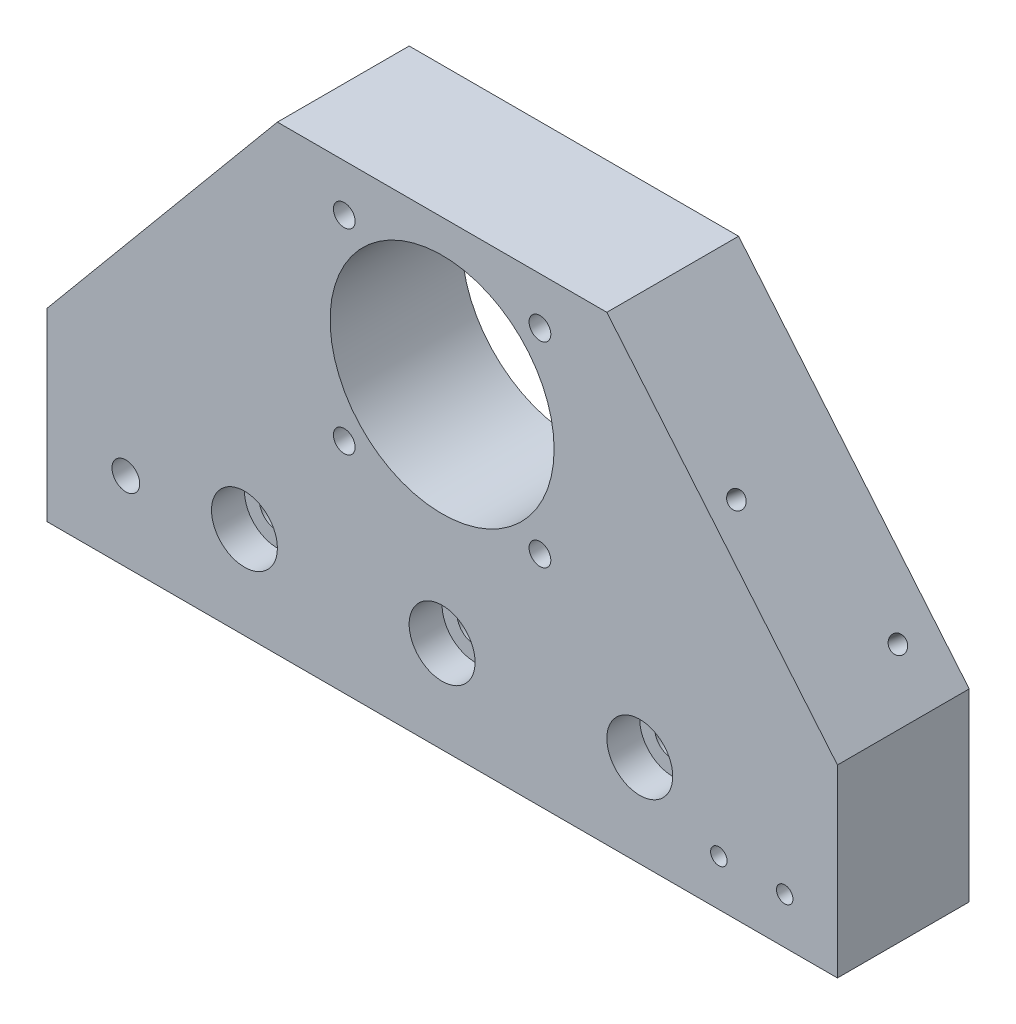
ISO-10303-21;
HEADER;
FILE_DESCRIPTION(('STEP AP214'),'2;1');
FILE_NAME('part.step','',(''),(''),'','','');
FILE_SCHEMA(('AUTOMOTIVE_DESIGN { 1 0 10303 214 1 1 1 1 }'));
ENDSEC;
DATA;
#1=APPLICATION_CONTEXT('core data for automotive mechanical design processes');
#2=APPLICATION_PROTOCOL_DEFINITION('international standard','automotive_design',2000,#1);
#3=PRODUCT_CONTEXT('',#1,'mechanical');
#4=PRODUCT('Part','Part','',(#3));
#5=PRODUCT_RELATED_PRODUCT_CATEGORY('part','',(#4));
#6=PRODUCT_DEFINITION_FORMATION('','',#4);
#7=PRODUCT_DEFINITION_CONTEXT('part definition',#1,'design');
#8=PRODUCT_DEFINITION('design','',#6,#7);
#9=PRODUCT_DEFINITION_SHAPE('','',#8);
#10=(LENGTH_UNIT() NAMED_UNIT(*) SI_UNIT(.MILLI.,.METRE.));
#11=(NAMED_UNIT(*) PLANE_ANGLE_UNIT() SI_UNIT($,.RADIAN.));
#12=(NAMED_UNIT(*) SI_UNIT($,.STERADIAN.) SOLID_ANGLE_UNIT());
#13=UNCERTAINTY_MEASURE_WITH_UNIT(LENGTH_MEASURE(1.E-05),#10,'distance_accuracy_value','');
#14=(GEOMETRIC_REPRESENTATION_CONTEXT(3) GLOBAL_UNCERTAINTY_ASSIGNED_CONTEXT((#13)) GLOBAL_UNIT_ASSIGNED_CONTEXT((#10,
#11,#12)) REPRESENTATION_CONTEXT('',''));
#15=CARTESIAN_POINT('',(0.,0.,0.));
#16=DIRECTION('',(0.,0.,1.));
#17=DIRECTION('',(1.,0.,0.));
#18=AXIS2_PLACEMENT_3D('',#15,#16,#17);
#19=CARTESIAN_POINT('',(-60.,0.,20.));
#20=DIRECTION('',(1.,0.,0.));
#21=DIRECTION('',(0.,0.,-1.));
#22=AXIS2_PLACEMENT_3D('',#19,#20,#21);
#23=PLANE('',#22);
#24=DIRECTION('',(0.,-1.,0.));
#25=VECTOR('',#24,1.);
#26=CARTESIAN_POINT('',(-60.,0.,0.));
#27=LINE('',#26,#25);
#28=CARTESIAN_POINT('',(-60.,28.,0.));
#29=VERTEX_POINT('',#28);
#30=CARTESIAN_POINT('',(-60.,0.,0.));
#31=VERTEX_POINT('',#30);
#32=EDGE_CURVE('E122',#29,#31,#27,.T.);
#33=ORIENTED_EDGE('',*,*,#32,.T.);
#34=DIRECTION('',(0.,0.,-1.));
#35=VECTOR('',#34,1.);
#36=CARTESIAN_POINT('',(-60.,0.,20.));
#37=LINE('',#36,#35);
#38=CARTESIAN_POINT('',(-60.,0.,20.));
#39=VERTEX_POINT('',#38);
#40=EDGE_CURVE('E11',#39,#31,#37,.T.);
#41=ORIENTED_EDGE('',*,*,#40,.F.);
#42=DIRECTION('',(0.,-1.,0.));
#43=VECTOR('',#42,1.);
#44=CARTESIAN_POINT('',(-60.,0.,20.));
#45=LINE('',#44,#43);
#46=CARTESIAN_POINT('',(-60.,28.,20.));
#47=VERTEX_POINT('',#46);
#48=EDGE_CURVE('E133',#47,#39,#45,.T.);
#49=ORIENTED_EDGE('',*,*,#48,.F.);
#50=DIRECTION('',(0.,0.,-1.));
#51=VECTOR('',#50,1.);
#52=CARTESIAN_POINT('',(-60.,28.,20.));
#53=LINE('',#52,#51);
#54=EDGE_CURVE('E118',#47,#29,#53,.T.);
#55=ORIENTED_EDGE('',*,*,#54,.T.);
#56=EDGE_LOOP('',(#33,#41,#49,#55));
#57=FACE_BOUND('',#56,.T.);
#58=ADVANCED_FACE('F35',(#57),#23,.F.);
#59=CARTESIAN_POINT('',(60.,0.,20.));
#60=DIRECTION('',(0.,1.,0.));
#61=DIRECTION('',(0.,0.,1.));
#62=AXIS2_PLACEMENT_3D('',#59,#60,#61);
#63=PLANE('',#62);
#64=CARTESIAN_POINT('',(-20.,0.,10.));
#65=DIRECTION('',(0.,-1.,0.));
#66=DIRECTION('',(0.,0.,-1.));
#67=AXIS2_PLACEMENT_3D('',#64,#65,#66);
#68=CIRCLE('',#67,1.64999999999999);
#69=CARTESIAN_POINT('',(-20.,0.,8.35000000000001));
#70=VERTEX_POINT('',#69);
#71=EDGE_CURVE('E206',#70,#70,#68,.T.);
#72=ORIENTED_EDGE('',*,*,#71,.F.);
#73=EDGE_LOOP('',(#72));
#74=FACE_BOUND('',#73,.T.);
#75=CARTESIAN_POINT('',(20.,0.,10.));
#76=DIRECTION('',(0.,-1.,0.));
#77=DIRECTION('',(0.,0.,-1.));
#78=AXIS2_PLACEMENT_3D('',#75,#76,#77);
#79=CIRCLE('',#78,1.64999999999999);
#80=CARTESIAN_POINT('',(20.,0.,8.35000000000001));
#81=VERTEX_POINT('',#80);
#82=EDGE_CURVE('E212',#81,#81,#79,.T.);
#83=ORIENTED_EDGE('',*,*,#82,.F.);
#84=EDGE_LOOP('',(#83));
#85=FACE_BOUND('',#84,.T.);
#86=DIRECTION('',(1.,0.,0.));
#87=VECTOR('',#86,1.);
#88=CARTESIAN_POINT('',(60.,0.,0.));
#89=LINE('',#88,#87);
#90=CARTESIAN_POINT('',(60.,0.,0.));
#91=VERTEX_POINT('',#90);
#92=EDGE_CURVE('E125',#31,#91,#89,.T.);
#93=ORIENTED_EDGE('',*,*,#92,.T.);
#94=DIRECTION('',(0.,0.,-1.));
#95=VECTOR('',#94,1.);
#96=CARTESIAN_POINT('',(60.,0.,20.));
#97=LINE('',#96,#95);
#98=CARTESIAN_POINT('',(60.,0.,20.));
#99=VERTEX_POINT('',#98);
#100=EDGE_CURVE('E43',#99,#91,#97,.T.);
#101=ORIENTED_EDGE('',*,*,#100,.F.);
#102=DIRECTION('',(1.,0.,0.));
#103=VECTOR('',#102,1.);
#104=CARTESIAN_POINT('',(60.,0.,20.));
#105=LINE('',#104,#103);
#106=EDGE_CURVE('E89',#39,#99,#105,.T.);
#107=ORIENTED_EDGE('',*,*,#106,.F.);
#108=ORIENTED_EDGE('',*,*,#40,.T.);
#109=EDGE_LOOP('',(#93,#101,#107,#108));
#110=FACE_BOUND('',#109,.T.);
#111=ADVANCED_FACE('F159',(#74,#85,#110),#63,.F.);
#112=CARTESIAN_POINT('',(60.,0.,20.));
#113=DIRECTION('',(-1.,0.,0.));
#114=DIRECTION('',(0.,0.,1.));
#115=AXIS2_PLACEMENT_3D('',#112,#113,#114);
#116=PLANE('',#115);
#117=DIRECTION('',(0.,1.,0.));
#118=VECTOR('',#117,1.);
#119=CARTESIAN_POINT('',(60.,0.,0.));
#120=LINE('',#119,#118);
#121=CARTESIAN_POINT('',(60.,28.,0.));
#122=VERTEX_POINT('',#121);
#123=EDGE_CURVE('E128',#91,#122,#120,.T.);
#124=ORIENTED_EDGE('',*,*,#123,.T.);
#125=DIRECTION('',(0.,0.,-1.));
#126=VECTOR('',#125,1.);
#127=CARTESIAN_POINT('',(60.,28.,20.));
#128=LINE('',#127,#126);
#129=CARTESIAN_POINT('',(60.,28.,20.));
#130=VERTEX_POINT('',#129);
#131=EDGE_CURVE('E113',#130,#122,#128,.T.);
#132=ORIENTED_EDGE('',*,*,#131,.F.);
#133=DIRECTION('',(0.,1.,0.));
#134=VECTOR('',#133,1.);
#135=CARTESIAN_POINT('',(60.,0.,20.));
#136=LINE('',#135,#134);
#137=EDGE_CURVE('E104',#99,#130,#136,.T.);
#138=ORIENTED_EDGE('',*,*,#137,.F.);
#139=ORIENTED_EDGE('',*,*,#100,.T.);
#140=EDGE_LOOP('',(#124,#132,#138,#139));
#141=FACE_BOUND('',#140,.T.);
#142=ADVANCED_FACE('F139',(#141),#116,.F.);
#143=CARTESIAN_POINT('',(60.,28.,20.));
#144=DIRECTION('',(-0.768221279597376,-0.64018439966448,0.));
#145=DIRECTION('',(0.64018439966448,-0.768221279597376,0.));
#146=AXIS2_PLACEMENT_3D('',#143,#144,#145);
#147=PLANE('',#146);
#148=CARTESIAN_POINT('',(40.6664311301327,51.2002826438407,16.));
#149=DIRECTION('',(0.768221279597376,0.64018439966448,0.));
#150=DIRECTION('',(-0.64018439966448,0.768221279597376,0.));
#151=AXIS2_PLACEMENT_3D('',#148,#149,#150);
#152=CIRCLE('',#151,1.24999999999999);
#153=CARTESIAN_POINT('',(39.8662006305521,52.1605592433375,16.));
#154=VERTEX_POINT('',#153);
#155=EDGE_CURVE('E180',#154,#154,#152,.T.);
#156=ORIENTED_EDGE('',*,*,#155,.F.);
#157=EDGE_LOOP('',(#156));
#158=FACE_BOUND('',#157,.T.);
#159=CARTESIAN_POINT('',(54.8785248026842,34.145770236779,5.7));
#160=DIRECTION('',(0.768221279597376,0.64018439966448,0.));
#161=DIRECTION('',(-0.64018439966448,0.768221279597376,0.));
#162=AXIS2_PLACEMENT_3D('',#159,#160,#161);
#163=CIRCLE('',#162,1.24999999999999);
#164=CARTESIAN_POINT('',(54.0782943031036,35.1060468362757,5.7));
#165=VERTEX_POINT('',#164);
#166=EDGE_CURVE('E183',#165,#165,#163,.T.);
#167=ORIENTED_EDGE('',*,*,#166,.F.);
#168=EDGE_LOOP('',(#167));
#169=FACE_BOUND('',#168,.T.);
#170=DIRECTION('',(-0.64018439966448,0.768221279597376,0.));
#171=VECTOR('',#170,1.);
#172=CARTESIAN_POINT('',(60.,28.,0.));
#173=LINE('',#172,#171);
#174=CARTESIAN_POINT('',(25.,70.,0.));
#175=VERTEX_POINT('',#174);
#176=EDGE_CURVE('E112',#122,#175,#173,.T.);
#177=ORIENTED_EDGE('',*,*,#176,.T.);
#178=DIRECTION('',(0.,0.,-1.));
#179=VECTOR('',#178,1.);
#180=CARTESIAN_POINT('',(25.,70.,20.));
#181=LINE('',#180,#179);
#182=CARTESIAN_POINT('',(25.,70.,20.));
#183=VERTEX_POINT('',#182);
#184=EDGE_CURVE('E109',#183,#175,#181,.T.);
#185=ORIENTED_EDGE('',*,*,#184,.F.);
#186=DIRECTION('',(-0.64018439966448,0.768221279597376,0.));
#187=VECTOR('',#186,1.);
#188=CARTESIAN_POINT('',(60.,28.,20.));
#189=LINE('',#188,#187);
#190=EDGE_CURVE('E98',#130,#183,#189,.T.);
#191=ORIENTED_EDGE('',*,*,#190,.F.);
#192=ORIENTED_EDGE('',*,*,#131,.T.);
#193=EDGE_LOOP('',(#177,#185,#191,#192));
#194=FACE_BOUND('',#193,.T.);
#195=ADVANCED_FACE('F110',(#158,#169,#194),#147,.F.);
#196=CARTESIAN_POINT('',(-25.,70.,20.));
#197=DIRECTION('',(0.,-1.,0.));
#198=DIRECTION('',(0.,0.,-1.));
#199=AXIS2_PLACEMENT_3D('',#196,#197,#198);
#200=PLANE('',#199);
#201=DIRECTION('',(-1.,0.,0.));
#202=VECTOR('',#201,1.);
#203=CARTESIAN_POINT('',(-25.,70.,0.));
#204=LINE('',#203,#202);
#205=CARTESIAN_POINT('',(-25.,70.,0.));
#206=VERTEX_POINT('',#205);
#207=EDGE_CURVE('E75',#175,#206,#204,.T.);
#208=ORIENTED_EDGE('',*,*,#207,.T.);
#209=DIRECTION('',(0.,0.,-1.));
#210=VECTOR('',#209,1.);
#211=CARTESIAN_POINT('',(-25.,70.,20.));
#212=LINE('',#211,#210);
#213=CARTESIAN_POINT('',(-25.,70.,20.));
#214=VERTEX_POINT('',#213);
#215=EDGE_CURVE('E114',#214,#206,#212,.T.);
#216=ORIENTED_EDGE('',*,*,#215,.F.);
#217=DIRECTION('',(-1.,0.,0.));
#218=VECTOR('',#217,1.);
#219=CARTESIAN_POINT('',(-25.,70.,20.));
#220=LINE('',#219,#218);
#221=EDGE_CURVE('E102',#183,#214,#220,.T.);
#222=ORIENTED_EDGE('',*,*,#221,.F.);
#223=ORIENTED_EDGE('',*,*,#184,.T.);
#224=EDGE_LOOP('',(#208,#216,#222,#223));
#225=FACE_BOUND('',#224,.T.);
#226=ADVANCED_FACE('F116',(#225),#200,.F.);
#227=CARTESIAN_POINT('',(-60.,28.,20.));
#228=DIRECTION('',(0.768221279597376,-0.64018439966448,0.));
#229=DIRECTION('',(0.64018439966448,0.768221279597376,0.));
#230=AXIS2_PLACEMENT_3D('',#227,#228,#229);
#231=PLANE('',#230);
#232=DIRECTION('',(-0.64018439966448,-0.768221279597376,0.));
#233=VECTOR('',#232,1.);
#234=CARTESIAN_POINT('',(-60.,28.,0.));
#235=LINE('',#234,#233);
#236=EDGE_CURVE('E81',#206,#29,#235,.T.);
#237=ORIENTED_EDGE('',*,*,#236,.T.);
#238=ORIENTED_EDGE('',*,*,#54,.F.);
#239=DIRECTION('',(-0.64018439966448,-0.768221279597376,0.));
#240=VECTOR('',#239,1.);
#241=CARTESIAN_POINT('',(-60.,28.,20.));
#242=LINE('',#241,#240);
#243=EDGE_CURVE('E51',#214,#47,#242,.T.);
#244=ORIENTED_EDGE('',*,*,#243,.F.);
#245=ORIENTED_EDGE('',*,*,#215,.T.);
#246=EDGE_LOOP('',(#237,#238,#244,#245));
#247=FACE_BOUND('',#246,.T.);
#248=ADVANCED_FACE('F146',(#247),#231,.F.);
#249=CARTESIAN_POINT('',(0.,0.,20.));
#250=DIRECTION('',(0.,0.,-1.));
#251=DIRECTION('',(-1.,0.,0.));
#252=AXIS2_PLACEMENT_3D('',#249,#250,#251);
#253=PLANE('',#252);
#254=CARTESIAN_POINT('',(-48.,12.,20.));
#255=DIRECTION('',(0.,0.,1.));
#256=DIRECTION('',(1.,0.,0.));
#257=AXIS2_PLACEMENT_3D('',#254,#255,#256);
#258=CIRCLE('',#257,2.09999999999999);
#259=CARTESIAN_POINT('',(-45.9,12.,20.));
#260=VERTEX_POINT('',#259);
#261=EDGE_CURVE('E438',#260,#260,#258,.T.);
#262=ORIENTED_EDGE('',*,*,#261,.F.);
#263=EDGE_LOOP('',(#262));
#264=FACE_BOUND('',#263,.T.);
#265=CARTESIAN_POINT('',(42.,7.,20.));
#266=DIRECTION('',(0.,0.,1.));
#267=DIRECTION('',(1.,0.,0.));
#268=AXIS2_PLACEMENT_3D('',#265,#266,#267);
#269=CIRCLE('',#268,1.24999999999999);
#270=CARTESIAN_POINT('',(43.25,7.,20.));
#271=VERTEX_POINT('',#270);
#272=EDGE_CURVE('E189',#271,#271,#269,.T.);
#273=ORIENTED_EDGE('',*,*,#272,.F.);
#274=EDGE_LOOP('',(#273));
#275=FACE_BOUND('',#274,.T.);
#276=CARTESIAN_POINT('',(52.,7.,20.));
#277=DIRECTION('',(0.,0.,1.));
#278=DIRECTION('',(1.,0.,0.));
#279=AXIS2_PLACEMENT_3D('',#276,#277,#278);
#280=CIRCLE('',#279,1.24999999999999);
#281=CARTESIAN_POINT('',(53.25,7.,20.));
#282=VERTEX_POINT('',#281);
#283=EDGE_CURVE('E200',#282,#282,#280,.T.);
#284=ORIENTED_EDGE('',*,*,#283,.F.);
#285=EDGE_LOOP('',(#284));
#286=FACE_BOUND('',#285,.T.);
#287=CARTESIAN_POINT('',(-14.8492424049174,62.8492424049175,20.));
#288=DIRECTION('',(0.,0.,1.));
#289=DIRECTION('',(1.,0.,0.));
#290=AXIS2_PLACEMENT_3D('',#287,#288,#289);
#291=CIRCLE('',#290,1.64999999999999);
#292=CARTESIAN_POINT('',(-13.1992424049175,62.8492424049175,20.));
#293=VERTEX_POINT('',#292);
#294=EDGE_CURVE('E218',#293,#293,#291,.T.);
#295=ORIENTED_EDGE('',*,*,#294,.F.);
#296=EDGE_LOOP('',(#295));
#297=FACE_BOUND('',#296,.T.);
#298=CARTESIAN_POINT('',(14.8492424049176,62.8492424049175,20.));
#299=DIRECTION('',(0.,0.,1.));
#300=DIRECTION('',(1.,0.,0.));
#301=AXIS2_PLACEMENT_3D('',#298,#299,#300);
#302=CIRCLE('',#301,1.64999999999999);
#303=CARTESIAN_POINT('',(16.4992424049175,62.8492424049175,20.));
#304=VERTEX_POINT('',#303);
#305=EDGE_CURVE('E224',#304,#304,#302,.T.);
#306=ORIENTED_EDGE('',*,*,#305,.F.);
#307=EDGE_LOOP('',(#306));
#308=FACE_BOUND('',#307,.T.);
#309=CARTESIAN_POINT('',(14.8492424049176,33.1507575950825,20.));
#310=DIRECTION('',(0.,0.,1.));
#311=DIRECTION('',(1.,0.,0.));
#312=AXIS2_PLACEMENT_3D('',#309,#310,#311);
#313=CIRCLE('',#312,1.64999999999999);
#314=CARTESIAN_POINT('',(16.4992424049175,33.1507575950825,20.));
#315=VERTEX_POINT('',#314);
#316=EDGE_CURVE('E230',#315,#315,#313,.T.);
#317=ORIENTED_EDGE('',*,*,#316,.F.);
#318=EDGE_LOOP('',(#317));
#319=FACE_BOUND('',#318,.T.);
#320=CARTESIAN_POINT('',(-14.8492424049174,33.1507575950825,20.));
#321=DIRECTION('',(0.,0.,1.));
#322=DIRECTION('',(1.,0.,0.));
#323=AXIS2_PLACEMENT_3D('',#320,#321,#322);
#324=CIRCLE('',#323,1.64999999999999);
#325=CARTESIAN_POINT('',(-13.1992424049175,33.1507575950825,20.));
#326=VERTEX_POINT('',#325);
#327=EDGE_CURVE('E236',#326,#326,#324,.T.);
#328=ORIENTED_EDGE('',*,*,#327,.F.);
#329=EDGE_LOOP('',(#328));
#330=FACE_BOUND('',#329,.T.);
#331=CARTESIAN_POINT('',(0.,48.,20.));
#332=DIRECTION('',(0.,0.,1.));
#333=DIRECTION('',(1.,0.,0.));
#334=AXIS2_PLACEMENT_3D('',#331,#332,#333);
#335=CIRCLE('',#334,17.);
#336=CARTESIAN_POINT('',(17.0000000000001,48.,20.));
#337=VERTEX_POINT('',#336);
#338=EDGE_CURVE('E242',#337,#337,#335,.T.);
#339=ORIENTED_EDGE('',*,*,#338,.F.);
#340=EDGE_LOOP('',(#339));
#341=FACE_BOUND('',#340,.T.);
#342=CARTESIAN_POINT('',(-30.,14.,20.));
#343=DIRECTION('',(0.,0.,1.));
#344=DIRECTION('',(1.,0.,0.));
#345=AXIS2_PLACEMENT_3D('',#342,#343,#344);
#346=CIRCLE('',#345,5.);
#347=CARTESIAN_POINT('',(-25.,14.,20.));
#348=VERTEX_POINT('',#347);
#349=EDGE_CURVE('E246',#348,#348,#346,.T.);
#350=ORIENTED_EDGE('',*,*,#349,.F.);
#351=EDGE_LOOP('',(#350));
#352=FACE_BOUND('',#351,.T.);
#353=CARTESIAN_POINT('',(0.,14.,20.));
#354=DIRECTION('',(0.,0.,1.));
#355=DIRECTION('',(1.,0.,0.));
#356=AXIS2_PLACEMENT_3D('',#353,#354,#355);
#357=CIRCLE('',#356,5.);
#358=CARTESIAN_POINT('',(5.,14.,20.));
#359=VERTEX_POINT('',#358);
#360=EDGE_CURVE('E260',#359,#359,#357,.T.);
#361=ORIENTED_EDGE('',*,*,#360,.F.);
#362=EDGE_LOOP('',(#361));
#363=FACE_BOUND('',#362,.T.);
#364=CARTESIAN_POINT('',(30.,14.,20.));
#365=DIRECTION('',(0.,0.,1.));
#366=DIRECTION('',(1.,0.,0.));
#367=AXIS2_PLACEMENT_3D('',#364,#365,#366);
#368=CIRCLE('',#367,5.);
#369=CARTESIAN_POINT('',(35.,14.,20.));
#370=VERTEX_POINT('',#369);
#371=EDGE_CURVE('E272',#370,#370,#368,.T.);
#372=ORIENTED_EDGE('',*,*,#371,.F.);
#373=EDGE_LOOP('',(#372));
#374=FACE_BOUND('',#373,.T.);
#375=ORIENTED_EDGE('',*,*,#48,.T.);
#376=ORIENTED_EDGE('',*,*,#106,.T.);
#377=ORIENTED_EDGE('',*,*,#137,.T.);
#378=ORIENTED_EDGE('',*,*,#190,.T.);
#379=ORIENTED_EDGE('',*,*,#221,.T.);
#380=ORIENTED_EDGE('',*,*,#243,.T.);
#381=EDGE_LOOP('',(#375,#376,#377,#378,#379,#380));
#382=FACE_BOUND('',#381,.T.);
#383=ADVANCED_FACE('F100',(#264,#275,#286,#297,#308,#319,#330,#341,#352,#363,#374,#382),#253,.F.);
#384=CARTESIAN_POINT('',(0.,0.,0.));
#385=DIRECTION('',(0.,0.,-1.));
#386=DIRECTION('',(-1.,0.,0.));
#387=AXIS2_PLACEMENT_3D('',#384,#385,#386);
#388=PLANE('',#387);
#389=CARTESIAN_POINT('',(-48.,12.,0.));
#390=DIRECTION('',(0.,0.,1.));
#391=DIRECTION('',(1.,0.,0.));
#392=AXIS2_PLACEMENT_3D('',#389,#390,#391);
#393=CIRCLE('',#392,2.1);
#394=CARTESIAN_POINT('',(-45.9,12.,0.));
#395=VERTEX_POINT('',#394);
#396=EDGE_CURVE('E321',#395,#395,#393,.T.);
#397=ORIENTED_EDGE('',*,*,#396,.T.);
#398=EDGE_LOOP('',(#397));
#399=FACE_BOUND('',#398,.T.);
#400=CARTESIAN_POINT('',(-14.8492424049174,62.8492424049175,0.));
#401=DIRECTION('',(0.,0.,1.));
#402=DIRECTION('',(1.,0.,0.));
#403=AXIS2_PLACEMENT_3D('',#400,#401,#402);
#404=CIRCLE('',#403,1.65);
#405=CARTESIAN_POINT('',(-13.1992424049175,62.8492424049175,0.));
#406=VERTEX_POINT('',#405);
#407=EDGE_CURVE('E221',#406,#406,#404,.T.);
#408=ORIENTED_EDGE('',*,*,#407,.T.);
#409=EDGE_LOOP('',(#408));
#410=FACE_BOUND('',#409,.T.);
#411=CARTESIAN_POINT('',(14.8492424049176,62.8492424049175,0.));
#412=DIRECTION('',(0.,0.,1.));
#413=DIRECTION('',(1.,0.,0.));
#414=AXIS2_PLACEMENT_3D('',#411,#412,#413);
#415=CIRCLE('',#414,1.65);
#416=CARTESIAN_POINT('',(16.4992424049176,62.8492424049175,0.));
#417=VERTEX_POINT('',#416);
#418=EDGE_CURVE('E227',#417,#417,#415,.T.);
#419=ORIENTED_EDGE('',*,*,#418,.T.);
#420=EDGE_LOOP('',(#419));
#421=FACE_BOUND('',#420,.T.);
#422=CARTESIAN_POINT('',(14.8492424049176,33.1507575950825,0.));
#423=DIRECTION('',(0.,0.,1.));
#424=DIRECTION('',(1.,0.,0.));
#425=AXIS2_PLACEMENT_3D('',#422,#423,#424);
#426=CIRCLE('',#425,1.65);
#427=CARTESIAN_POINT('',(16.4992424049176,33.1507575950825,0.));
#428=VERTEX_POINT('',#427);
#429=EDGE_CURVE('E233',#428,#428,#426,.T.);
#430=ORIENTED_EDGE('',*,*,#429,.T.);
#431=EDGE_LOOP('',(#430));
#432=FACE_BOUND('',#431,.T.);
#433=CARTESIAN_POINT('',(-14.8492424049174,33.1507575950825,0.));
#434=DIRECTION('',(0.,0.,1.));
#435=DIRECTION('',(1.,0.,0.));
#436=AXIS2_PLACEMENT_3D('',#433,#434,#435);
#437=CIRCLE('',#436,1.65);
#438=CARTESIAN_POINT('',(-13.1992424049175,33.1507575950825,0.));
#439=VERTEX_POINT('',#438);
#440=EDGE_CURVE('E239',#439,#439,#437,.T.);
#441=ORIENTED_EDGE('',*,*,#440,.T.);
#442=EDGE_LOOP('',(#441));
#443=FACE_BOUND('',#442,.T.);
#444=CARTESIAN_POINT('',(0.,48.,0.));
#445=DIRECTION('',(0.,0.,1.));
#446=DIRECTION('',(1.,0.,0.));
#447=AXIS2_PLACEMENT_3D('',#444,#445,#446);
#448=CIRCLE('',#447,17.);
#449=CARTESIAN_POINT('',(17.0000000000001,48.,0.));
#450=VERTEX_POINT('',#449);
#451=EDGE_CURVE('E243',#450,#450,#448,.T.);
#452=ORIENTED_EDGE('',*,*,#451,.T.);
#453=EDGE_LOOP('',(#452));
#454=FACE_BOUND('',#453,.T.);
#455=CARTESIAN_POINT('',(-30.,14.,0.));
#456=DIRECTION('',(0.,0.,1.));
#457=DIRECTION('',(1.,0.,0.));
#458=AXIS2_PLACEMENT_3D('',#455,#456,#457);
#459=CIRCLE('',#458,2.75);
#460=CARTESIAN_POINT('',(-27.25,14.,0.));
#461=VERTEX_POINT('',#460);
#462=EDGE_CURVE('E257',#461,#461,#459,.T.);
#463=ORIENTED_EDGE('',*,*,#462,.T.);
#464=EDGE_LOOP('',(#463));
#465=FACE_BOUND('',#464,.T.);
#466=CARTESIAN_POINT('',(0.,14.,0.));
#467=DIRECTION('',(0.,0.,1.));
#468=DIRECTION('',(1.,0.,0.));
#469=AXIS2_PLACEMENT_3D('',#466,#467,#468);
#470=CIRCLE('',#469,2.74999999999999);
#471=CARTESIAN_POINT('',(2.74999999999999,14.,0.));
#472=VERTEX_POINT('',#471);
#473=EDGE_CURVE('E269',#472,#472,#470,.T.);
#474=ORIENTED_EDGE('',*,*,#473,.T.);
#475=EDGE_LOOP('',(#474));
#476=FACE_BOUND('',#475,.T.);
#477=CARTESIAN_POINT('',(30.,14.,0.));
#478=DIRECTION('',(0.,0.,1.));
#479=DIRECTION('',(1.,0.,0.));
#480=AXIS2_PLACEMENT_3D('',#477,#478,#479);
#481=CIRCLE('',#480,2.75);
#482=CARTESIAN_POINT('',(32.75,14.,0.));
#483=VERTEX_POINT('',#482);
#484=EDGE_CURVE('E126',#483,#483,#481,.T.);
#485=ORIENTED_EDGE('',*,*,#484,.T.);
#486=EDGE_LOOP('',(#485));
#487=FACE_BOUND('',#486,.T.);
#488=ORIENTED_EDGE('',*,*,#32,.F.);
#489=ORIENTED_EDGE('',*,*,#236,.F.);
#490=ORIENTED_EDGE('',*,*,#207,.F.);
#491=ORIENTED_EDGE('',*,*,#176,.F.);
#492=ORIENTED_EDGE('',*,*,#123,.F.);
#493=ORIENTED_EDGE('',*,*,#92,.F.);
#494=EDGE_LOOP('',(#488,#489,#490,#491,#492,#493));
#495=FACE_BOUND('',#494,.T.);
#496=ADVANCED_FACE('F142',(#399,#410,#421,#432,#443,#454,#465,#476,#487,#495),#388,.T.);
#497=CARTESIAN_POINT('',(30.,14.,20.));
#498=DIRECTION('',(0.,0.,1.));
#499=DIRECTION('',(1.,0.,0.));
#500=AXIS2_PLACEMENT_3D('',#497,#498,#499);
#501=CYLINDRICAL_SURFACE('',#500,2.75);
#502=ORIENTED_EDGE('',*,*,#484,.F.);
#503=EDGE_LOOP('',(#502));
#504=FACE_BOUND('',#503,.T.);
#505=CARTESIAN_POINT('',(30.,14.,15.));
#506=DIRECTION('',(0.,0.,1.));
#507=DIRECTION('',(1.,0.,0.));
#508=AXIS2_PLACEMENT_3D('',#505,#506,#507);
#509=CIRCLE('',#508,2.75);
#510=CARTESIAN_POINT('',(32.75,14.,15.));
#511=VERTEX_POINT('',#510);
#512=EDGE_CURVE('E278',#511,#511,#509,.T.);
#513=ORIENTED_EDGE('',*,*,#512,.T.);
#514=EDGE_LOOP('',(#513));
#515=FACE_BOUND('',#514,.T.);
#516=ADVANCED_FACE('F287',(#504,#515),#501,.F.);
#517=CARTESIAN_POINT('',(32.75,14.,15.));
#518=DIRECTION('',(0.,0.,-1.));
#519=DIRECTION('',(-1.,0.,0.));
#520=AXIS2_PLACEMENT_3D('',#517,#518,#519);
#521=PLANE('',#520);
#522=ORIENTED_EDGE('',*,*,#512,.F.);
#523=EDGE_LOOP('',(#522));
#524=FACE_BOUND('',#523,.T.);
#525=CARTESIAN_POINT('',(30.,14.,15.));
#526=DIRECTION('',(0.,0.,1.));
#527=DIRECTION('',(1.,0.,0.));
#528=AXIS2_PLACEMENT_3D('',#525,#526,#527);
#529=CIRCLE('',#528,5.);
#530=CARTESIAN_POINT('',(35.,14.,15.));
#531=VERTEX_POINT('',#530);
#532=EDGE_CURVE('E275',#531,#531,#529,.T.);
#533=ORIENTED_EDGE('',*,*,#532,.T.);
#534=EDGE_LOOP('',(#533));
#535=FACE_BOUND('',#534,.T.);
#536=ADVANCED_FACE('F290',(#524,#535),#521,.F.);
#537=CARTESIAN_POINT('',(30.,14.,20.));
#538=DIRECTION('',(0.,0.,1.));
#539=DIRECTION('',(1.,0.,0.));
#540=AXIS2_PLACEMENT_3D('',#537,#538,#539);
#541=CYLINDRICAL_SURFACE('',#540,5.);
#542=ORIENTED_EDGE('',*,*,#532,.F.);
#543=EDGE_LOOP('',(#542));
#544=FACE_BOUND('',#543,.T.);
#545=ORIENTED_EDGE('',*,*,#371,.T.);
#546=EDGE_LOOP('',(#545));
#547=FACE_BOUND('',#546,.T.);
#548=ADVANCED_FACE('F296',(#544,#547),#541,.F.);
#549=CARTESIAN_POINT('',(0.,14.,20.));
#550=DIRECTION('',(0.,0.,1.));
#551=DIRECTION('',(1.,0.,0.));
#552=AXIS2_PLACEMENT_3D('',#549,#550,#551);
#553=CYLINDRICAL_SURFACE('',#552,2.75);
#554=ORIENTED_EDGE('',*,*,#473,.F.);
#555=EDGE_LOOP('',(#554));
#556=FACE_BOUND('',#555,.T.);
#557=CARTESIAN_POINT('',(0.,14.,15.));
#558=DIRECTION('',(0.,0.,1.));
#559=DIRECTION('',(1.,0.,0.));
#560=AXIS2_PLACEMENT_3D('',#557,#558,#559);
#561=CIRCLE('',#560,2.75);
#562=CARTESIAN_POINT('',(2.75,14.,15.));
#563=VERTEX_POINT('',#562);
#564=EDGE_CURVE('E266',#563,#563,#561,.T.);
#565=ORIENTED_EDGE('',*,*,#564,.T.);
#566=EDGE_LOOP('',(#565));
#567=FACE_BOUND('',#566,.T.);
#568=ADVANCED_FACE('F302',(#556,#567),#553,.F.);
#569=CARTESIAN_POINT('',(2.75,14.,15.));
#570=DIRECTION('',(0.,0.,-1.));
#571=DIRECTION('',(-1.,0.,0.));
#572=AXIS2_PLACEMENT_3D('',#569,#570,#571);
#573=PLANE('',#572);
#574=ORIENTED_EDGE('',*,*,#564,.F.);
#575=EDGE_LOOP('',(#574));
#576=FACE_BOUND('',#575,.T.);
#577=CARTESIAN_POINT('',(0.,14.,15.));
#578=DIRECTION('',(0.,0.,1.));
#579=DIRECTION('',(1.,0.,0.));
#580=AXIS2_PLACEMENT_3D('',#577,#578,#579);
#581=CIRCLE('',#580,5.);
#582=CARTESIAN_POINT('',(5.,14.,15.));
#583=VERTEX_POINT('',#582);
#584=EDGE_CURVE('E263',#583,#583,#581,.T.);
#585=ORIENTED_EDGE('',*,*,#584,.T.);
#586=EDGE_LOOP('',(#585));
#587=FACE_BOUND('',#586,.T.);
#588=ADVANCED_FACE('F309',(#576,#587),#573,.F.);
#589=CARTESIAN_POINT('',(0.,14.,20.));
#590=DIRECTION('',(0.,0.,1.));
#591=DIRECTION('',(1.,0.,0.));
#592=AXIS2_PLACEMENT_3D('',#589,#590,#591);
#593=CYLINDRICAL_SURFACE('',#592,5.);
#594=ORIENTED_EDGE('',*,*,#584,.F.);
#595=EDGE_LOOP('',(#594));
#596=FACE_BOUND('',#595,.T.);
#597=ORIENTED_EDGE('',*,*,#360,.T.);
#598=EDGE_LOOP('',(#597));
#599=FACE_BOUND('',#598,.T.);
#600=ADVANCED_FACE('F340',(#596,#599),#593,.F.);
#601=CARTESIAN_POINT('',(-30.,14.,20.));
#602=DIRECTION('',(0.,0.,1.));
#603=DIRECTION('',(1.,0.,0.));
#604=AXIS2_PLACEMENT_3D('',#601,#602,#603);
#605=CYLINDRICAL_SURFACE('',#604,2.75);
#606=ORIENTED_EDGE('',*,*,#462,.F.);
#607=EDGE_LOOP('',(#606));
#608=FACE_BOUND('',#607,.T.);
#609=CARTESIAN_POINT('',(-30.,14.,15.));
#610=DIRECTION('',(0.,0.,1.));
#611=DIRECTION('',(1.,0.,0.));
#612=AXIS2_PLACEMENT_3D('',#609,#610,#611);
#613=CIRCLE('',#612,2.75);
#614=CARTESIAN_POINT('',(-27.25,14.,15.));
#615=VERTEX_POINT('',#614);
#616=EDGE_CURVE('E254',#615,#615,#613,.T.);
#617=ORIENTED_EDGE('',*,*,#616,.T.);
#618=EDGE_LOOP('',(#617));
#619=FACE_BOUND('',#618,.T.);
#620=ADVANCED_FACE('F345',(#608,#619),#605,.F.);
#621=CARTESIAN_POINT('',(-27.25,14.,15.));
#622=DIRECTION('',(0.,0.,-1.));
#623=DIRECTION('',(-1.,0.,0.));
#624=AXIS2_PLACEMENT_3D('',#621,#622,#623);
#625=PLANE('',#624);
#626=ORIENTED_EDGE('',*,*,#616,.F.);
#627=EDGE_LOOP('',(#626));
#628=FACE_BOUND('',#627,.T.);
#629=CARTESIAN_POINT('',(-30.,14.,15.));
#630=DIRECTION('',(0.,0.,1.));
#631=DIRECTION('',(1.,0.,0.));
#632=AXIS2_PLACEMENT_3D('',#629,#630,#631);
#633=CIRCLE('',#632,5.);
#634=CARTESIAN_POINT('',(-25.,14.,15.));
#635=VERTEX_POINT('',#634);
#636=EDGE_CURVE('E251',#635,#635,#633,.T.);
#637=ORIENTED_EDGE('',*,*,#636,.T.);
#638=EDGE_LOOP('',(#637));
#639=FACE_BOUND('',#638,.T.);
#640=ADVANCED_FACE('F352',(#628,#639),#625,.F.);
#641=CARTESIAN_POINT('',(-30.,14.,20.));
#642=DIRECTION('',(0.,0.,1.));
#643=DIRECTION('',(1.,0.,0.));
#644=AXIS2_PLACEMENT_3D('',#641,#642,#643);
#645=CYLINDRICAL_SURFACE('',#644,5.);
#646=ORIENTED_EDGE('',*,*,#636,.F.);
#647=EDGE_LOOP('',(#646));
#648=FACE_BOUND('',#647,.T.);
#649=ORIENTED_EDGE('',*,*,#349,.T.);
#650=EDGE_LOOP('',(#649));
#651=FACE_BOUND('',#650,.T.);
#652=ADVANCED_FACE('F358',(#648,#651),#645,.F.);
#653=CARTESIAN_POINT('',(0.,48.,0.));
#654=DIRECTION('',(0.,0.,1.));
#655=DIRECTION('',(1.,0.,0.));
#656=AXIS2_PLACEMENT_3D('',#653,#654,#655);
#657=CYLINDRICAL_SURFACE('',#656,17.);
#658=ORIENTED_EDGE('',*,*,#451,.F.);
#659=EDGE_LOOP('',(#658));
#660=FACE_BOUND('',#659,.T.);
#661=ORIENTED_EDGE('',*,*,#338,.T.);
#662=EDGE_LOOP('',(#661));
#663=FACE_BOUND('',#662,.T.);
#664=ADVANCED_FACE('F362',(#660,#663),#657,.F.);
#665=CARTESIAN_POINT('',(-14.8492424049174,33.1507575950825,20.));
#666=DIRECTION('',(0.,0.,1.));
#667=DIRECTION('',(1.,0.,0.));
#668=AXIS2_PLACEMENT_3D('',#665,#666,#667);
#669=CYLINDRICAL_SURFACE('',#668,1.64999999999999);
#670=ORIENTED_EDGE('',*,*,#440,.F.);
#671=EDGE_LOOP('',(#670));
#672=FACE_BOUND('',#671,.T.);
#673=ORIENTED_EDGE('',*,*,#327,.T.);
#674=EDGE_LOOP('',(#673));
#675=FACE_BOUND('',#674,.T.);
#676=ADVANCED_FACE('F366',(#672,#675),#669,.F.);
#677=CARTESIAN_POINT('',(14.8492424049176,33.1507575950825,20.));
#678=DIRECTION('',(0.,0.,1.));
#679=DIRECTION('',(1.,0.,0.));
#680=AXIS2_PLACEMENT_3D('',#677,#678,#679);
#681=CYLINDRICAL_SURFACE('',#680,1.64999999999999);
#682=ORIENTED_EDGE('',*,*,#429,.F.);
#683=EDGE_LOOP('',(#682));
#684=FACE_BOUND('',#683,.T.);
#685=ORIENTED_EDGE('',*,*,#316,.T.);
#686=EDGE_LOOP('',(#685));
#687=FACE_BOUND('',#686,.T.);
#688=ADVANCED_FACE('F370',(#684,#687),#681,.F.);
#689=CARTESIAN_POINT('',(14.8492424049176,62.8492424049175,20.));
#690=DIRECTION('',(0.,0.,1.));
#691=DIRECTION('',(1.,0.,0.));
#692=AXIS2_PLACEMENT_3D('',#689,#690,#691);
#693=CYLINDRICAL_SURFACE('',#692,1.64999999999999);
#694=ORIENTED_EDGE('',*,*,#418,.F.);
#695=EDGE_LOOP('',(#694));
#696=FACE_BOUND('',#695,.T.);
#697=ORIENTED_EDGE('',*,*,#305,.T.);
#698=EDGE_LOOP('',(#697));
#699=FACE_BOUND('',#698,.T.);
#700=ADVANCED_FACE('F374',(#696,#699),#693,.F.);
#701=CARTESIAN_POINT('',(-14.8492424049174,62.8492424049175,20.));
#702=DIRECTION('',(0.,0.,1.));
#703=DIRECTION('',(1.,0.,0.));
#704=AXIS2_PLACEMENT_3D('',#701,#702,#703);
#705=CYLINDRICAL_SURFACE('',#704,1.64999999999999);
#706=ORIENTED_EDGE('',*,*,#407,.F.);
#707=EDGE_LOOP('',(#706));
#708=FACE_BOUND('',#707,.T.);
#709=ORIENTED_EDGE('',*,*,#294,.T.);
#710=EDGE_LOOP('',(#709));
#711=FACE_BOUND('',#710,.T.);
#712=ADVANCED_FACE('F378',(#708,#711),#705,.F.);
#713=CARTESIAN_POINT('',(20.,15.,10.));
#714=DIRECTION('',(0.,-1.,0.));
#715=DIRECTION('',(0.,0.,-1.));
#716=AXIS2_PLACEMENT_3D('',#713,#714,#715);
#717=CONICAL_SURFACE('',#716,1.65,1.02974425867665);
#718=CARTESIAN_POINT('',(20.,15.9914200213955,10.));
#719=VERTEX_POINT('',#718);
#720=VERTEX_LOOP('',#719);
#721=FACE_BOUND('',#720,.T.);
#722=CARTESIAN_POINT('',(20.,15.,10.));
#723=DIRECTION('',(0.,-1.,0.));
#724=DIRECTION('',(0.,0.,-1.));
#725=AXIS2_PLACEMENT_3D('',#722,#723,#724);
#726=CIRCLE('',#725,1.65);
#727=CARTESIAN_POINT('',(20.,15.,8.35));
#728=VERTEX_POINT('',#727);
#729=EDGE_CURVE('E215',#728,#728,#726,.T.);
#730=ORIENTED_EDGE('',*,*,#729,.T.);
#731=EDGE_LOOP('',(#730));
#732=FACE_BOUND('',#731,.T.);
#733=ADVANCED_FACE('F382',(#721,#732),#717,.F.);
#734=CARTESIAN_POINT('',(20.,0.,10.));
#735=DIRECTION('',(0.,-1.,0.));
#736=DIRECTION('',(0.,0.,-1.));
#737=AXIS2_PLACEMENT_3D('',#734,#735,#736);
#738=CYLINDRICAL_SURFACE('',#737,1.64999999999999);
#739=ORIENTED_EDGE('',*,*,#729,.F.);
#740=EDGE_LOOP('',(#739));
#741=FACE_BOUND('',#740,.T.);
#742=ORIENTED_EDGE('',*,*,#82,.T.);
#743=EDGE_LOOP('',(#742));
#744=FACE_BOUND('',#743,.T.);
#745=ADVANCED_FACE('F386',(#741,#744),#738,.F.);
#746=CARTESIAN_POINT('',(-20.,15.,10.));
#747=DIRECTION('',(0.,-1.,0.));
#748=DIRECTION('',(0.,0.,-1.));
#749=AXIS2_PLACEMENT_3D('',#746,#747,#748);
#750=CONICAL_SURFACE('',#749,1.65,1.02974425867665);
#751=CARTESIAN_POINT('',(-20.,15.9914200213955,10.));
#752=VERTEX_POINT('',#751);
#753=VERTEX_LOOP('',#752);
#754=FACE_BOUND('',#753,.T.);
#755=CARTESIAN_POINT('',(-20.,15.,10.));
#756=DIRECTION('',(0.,-1.,0.));
#757=DIRECTION('',(0.,0.,-1.));
#758=AXIS2_PLACEMENT_3D('',#755,#756,#757);
#759=CIRCLE('',#758,1.65);
#760=CARTESIAN_POINT('',(-20.,15.,8.35));
#761=VERTEX_POINT('',#760);
#762=EDGE_CURVE('E209',#761,#761,#759,.T.);
#763=ORIENTED_EDGE('',*,*,#762,.T.);
#764=EDGE_LOOP('',(#763));
#765=FACE_BOUND('',#764,.T.);
#766=ADVANCED_FACE('F390',(#754,#765),#750,.F.);
#767=CARTESIAN_POINT('',(-20.,0.,10.));
#768=DIRECTION('',(0.,-1.,0.));
#769=DIRECTION('',(0.,0.,-1.));
#770=AXIS2_PLACEMENT_3D('',#767,#768,#769);
#771=CYLINDRICAL_SURFACE('',#770,1.64999999999999);
#772=ORIENTED_EDGE('',*,*,#762,.F.);
#773=EDGE_LOOP('',(#772));
#774=FACE_BOUND('',#773,.T.);
#775=ORIENTED_EDGE('',*,*,#71,.T.);
#776=EDGE_LOOP('',(#775));
#777=FACE_BOUND('',#776,.T.);
#778=ADVANCED_FACE('F394',(#774,#777),#771,.F.);
#779=CARTESIAN_POINT('',(52.,7.,12.5));
#780=DIRECTION('',(0.,0.,1.));
#781=DIRECTION('',(1.,0.,0.));
#782=AXIS2_PLACEMENT_3D('',#779,#780,#781);
#783=CONICAL_SURFACE('',#782,1.24999999999999,1.02974425867665);
#784=CARTESIAN_POINT('',(52.,7.,11.7489242262155));
#785=VERTEX_POINT('',#784);
#786=VERTEX_LOOP('',#785);
#787=FACE_BOUND('',#786,.T.);
#788=CARTESIAN_POINT('',(52.,7.,12.5));
#789=DIRECTION('',(0.,0.,1.));
#790=DIRECTION('',(1.,0.,0.));
#791=AXIS2_PLACEMENT_3D('',#788,#789,#790);
#792=CIRCLE('',#791,1.24999999999999);
#793=CARTESIAN_POINT('',(53.25,7.,12.5));
#794=VERTEX_POINT('',#793);
#795=EDGE_CURVE('E203',#794,#794,#792,.T.);
#796=ORIENTED_EDGE('',*,*,#795,.T.);
#797=EDGE_LOOP('',(#796));
#798=FACE_BOUND('',#797,.T.);
#799=ADVANCED_FACE('F398',(#787,#798),#783,.F.);
#800=CARTESIAN_POINT('',(52.,7.,20.));
#801=DIRECTION('',(0.,0.,1.));
#802=DIRECTION('',(1.,0.,0.));
#803=AXIS2_PLACEMENT_3D('',#800,#801,#802);
#804=CYLINDRICAL_SURFACE('',#803,1.24999999999999);
#805=ORIENTED_EDGE('',*,*,#795,.F.);
#806=EDGE_LOOP('',(#805));
#807=FACE_BOUND('',#806,.T.);
#808=ORIENTED_EDGE('',*,*,#283,.T.);
#809=EDGE_LOOP('',(#808));
#810=FACE_BOUND('',#809,.T.);
#811=ADVANCED_FACE('F402',(#807,#810),#804,.F.);
#812=CARTESIAN_POINT('',(42.,7.,12.5));
#813=DIRECTION('',(0.,0.,1.));
#814=DIRECTION('',(1.,0.,0.));
#815=AXIS2_PLACEMENT_3D('',#812,#813,#814);
#816=CONICAL_SURFACE('',#815,1.24999999999999,1.02974425867665);
#817=CARTESIAN_POINT('',(42.,7.,11.7489242262155));
#818=VERTEX_POINT('',#817);
#819=VERTEX_LOOP('',#818);
#820=FACE_BOUND('',#819,.T.);
#821=CARTESIAN_POINT('',(42.,7.,12.5));
#822=DIRECTION('',(0.,0.,1.));
#823=DIRECTION('',(1.,0.,0.));
#824=AXIS2_PLACEMENT_3D('',#821,#822,#823);
#825=CIRCLE('',#824,1.24999999999999);
#826=CARTESIAN_POINT('',(43.25,7.,12.5));
#827=VERTEX_POINT('',#826);
#828=EDGE_CURVE('E197',#827,#827,#825,.T.);
#829=ORIENTED_EDGE('',*,*,#828,.T.);
#830=EDGE_LOOP('',(#829));
#831=FACE_BOUND('',#830,.T.);
#832=ADVANCED_FACE('F406',(#820,#831),#816,.F.);
#833=CARTESIAN_POINT('',(42.,7.,20.));
#834=DIRECTION('',(0.,0.,1.));
#835=DIRECTION('',(1.,0.,0.));
#836=AXIS2_PLACEMENT_3D('',#833,#834,#835);
#837=CYLINDRICAL_SURFACE('',#836,1.24999999999999);
#838=ORIENTED_EDGE('',*,*,#828,.F.);
#839=EDGE_LOOP('',(#838));
#840=FACE_BOUND('',#839,.T.);
#841=ORIENTED_EDGE('',*,*,#272,.T.);
#842=EDGE_LOOP('',(#841));
#843=FACE_BOUND('',#842,.T.);
#844=ADVANCED_FACE('F410',(#840,#843),#837,.F.);
#845=CARTESIAN_POINT('',(46.0439800873143,26.7836496406375,5.7));
#846=DIRECTION('',(0.768221279597376,0.64018439966448,0.));
#847=DIRECTION('',(-0.64018439966448,0.768221279597376,0.));
#848=AXIS2_PLACEMENT_3D('',#845,#846,#847);
#849=CONICAL_SURFACE('',#848,1.24999999999999,1.02974425867665);
#850=CARTESIAN_POINT('',(45.4669876953031,26.3028226472947,5.69999999999999));
#851=VERTEX_POINT('',#850);
#852=VERTEX_LOOP('',#851);
#853=FACE_BOUND('',#852,.T.);
#854=CARTESIAN_POINT('',(46.0439800873143,26.7836496406375,5.7));
#855=DIRECTION('',(0.768221279597376,0.64018439966448,0.));
#856=DIRECTION('',(-0.64018439966448,0.768221279597376,0.));
#857=AXIS2_PLACEMENT_3D('',#854,#855,#856);
#858=CIRCLE('',#857,1.24999999999999);
#859=CARTESIAN_POINT('',(45.2437495877338,27.7439262401342,5.7));
#860=VERTEX_POINT('',#859);
#861=EDGE_CURVE('E185',#860,#860,#858,.T.);
#862=ORIENTED_EDGE('',*,*,#861,.T.);
#863=EDGE_LOOP('',(#862));
#864=FACE_BOUND('',#863,.T.);
#865=ADVANCED_FACE('F414',(#853,#864),#849,.F.);
#866=CARTESIAN_POINT('',(54.8785248026842,34.145770236779,5.7));
#867=DIRECTION('',(0.768221279597376,0.64018439966448,0.));
#868=DIRECTION('',(-0.64018439966448,0.768221279597376,0.));
#869=AXIS2_PLACEMENT_3D('',#866,#867,#868);
#870=CYLINDRICAL_SURFACE('',#869,1.24999999999999);
#871=ORIENTED_EDGE('',*,*,#861,.F.);
#872=EDGE_LOOP('',(#871));
#873=FACE_BOUND('',#872,.T.);
#874=ORIENTED_EDGE('',*,*,#166,.T.);
#875=EDGE_LOOP('',(#874));
#876=FACE_BOUND('',#875,.T.);
#877=ADVANCED_FACE('F418',(#873,#876),#870,.F.);
#878=CARTESIAN_POINT('',(31.8318864147629,43.8381620476992,16.));
#879=DIRECTION('',(0.768221279597376,0.64018439966448,0.));
#880=DIRECTION('',(-0.64018439966448,0.768221279597376,0.));
#881=AXIS2_PLACEMENT_3D('',#878,#879,#880);
#882=CONICAL_SURFACE('',#881,1.24999999999999,1.02974425867665);
#883=CARTESIAN_POINT('',(31.2548940227516,43.3573350543565,16.));
#884=VERTEX_POINT('',#883);
#885=VERTEX_LOOP('',#884);
#886=FACE_BOUND('',#885,.T.);
#887=CARTESIAN_POINT('',(31.8318864147629,43.8381620476992,16.));
#888=DIRECTION('',(0.768221279597376,0.64018439966448,0.));
#889=DIRECTION('',(-0.64018439966448,0.768221279597376,0.));
#890=AXIS2_PLACEMENT_3D('',#887,#888,#889);
#891=CIRCLE('',#890,1.24999999999999);
#892=CARTESIAN_POINT('',(31.0316559151823,44.7984386471959,16.));
#893=VERTEX_POINT('',#892);
#894=EDGE_CURVE('E186',#893,#893,#891,.T.);
#895=ORIENTED_EDGE('',*,*,#894,.T.);
#896=EDGE_LOOP('',(#895));
#897=FACE_BOUND('',#896,.T.);
#898=ADVANCED_FACE('F422',(#886,#897),#882,.F.);
#899=CARTESIAN_POINT('',(40.6664311301327,51.2002826438407,16.));
#900=DIRECTION('',(0.768221279597376,0.64018439966448,0.));
#901=DIRECTION('',(-0.64018439966448,0.768221279597376,0.));
#902=AXIS2_PLACEMENT_3D('',#899,#900,#901);
#903=CYLINDRICAL_SURFACE('',#902,1.24999999999999);
#904=ORIENTED_EDGE('',*,*,#894,.F.);
#905=EDGE_LOOP('',(#904));
#906=FACE_BOUND('',#905,.T.);
#907=ORIENTED_EDGE('',*,*,#155,.T.);
#908=EDGE_LOOP('',(#907));
#909=FACE_BOUND('',#908,.T.);
#910=ADVANCED_FACE('F426',(#906,#909),#903,.F.);
#911=CARTESIAN_POINT('',(-48.,12.,20.));
#912=DIRECTION('',(0.,0.,1.));
#913=DIRECTION('',(1.,0.,0.));
#914=AXIS2_PLACEMENT_3D('',#911,#912,#913);
#915=CYLINDRICAL_SURFACE('',#914,2.09999999999999);
#916=ORIENTED_EDGE('',*,*,#396,.F.);
#917=EDGE_LOOP('',(#916));
#918=FACE_BOUND('',#917,.T.);
#919=ORIENTED_EDGE('',*,*,#261,.T.);
#920=EDGE_LOOP('',(#919));
#921=FACE_BOUND('',#920,.T.);
#922=ADVANCED_FACE('F430',(#918,#921),#915,.F.);
#923=CLOSED_SHELL('',(#58,#111,#142,#195,#226,#248,#383,#496,#516,#536,#548,#568,#588,#600,#620,
#640,#652,#664,#676,#688,#700,#712,#733,#745,#766,#778,#799,#811,#832,#844,#865,#877,#898,#910,#922));
#924=MANIFOLD_SOLID_BREP('B2',#923);
#925=ADVANCED_BREP_SHAPE_REPRESENTATION('',(#18,#924),#14);
#926=SHAPE_DEFINITION_REPRESENTATION(#9,#925);
ENDSEC;
END-ISO-10303-21;
